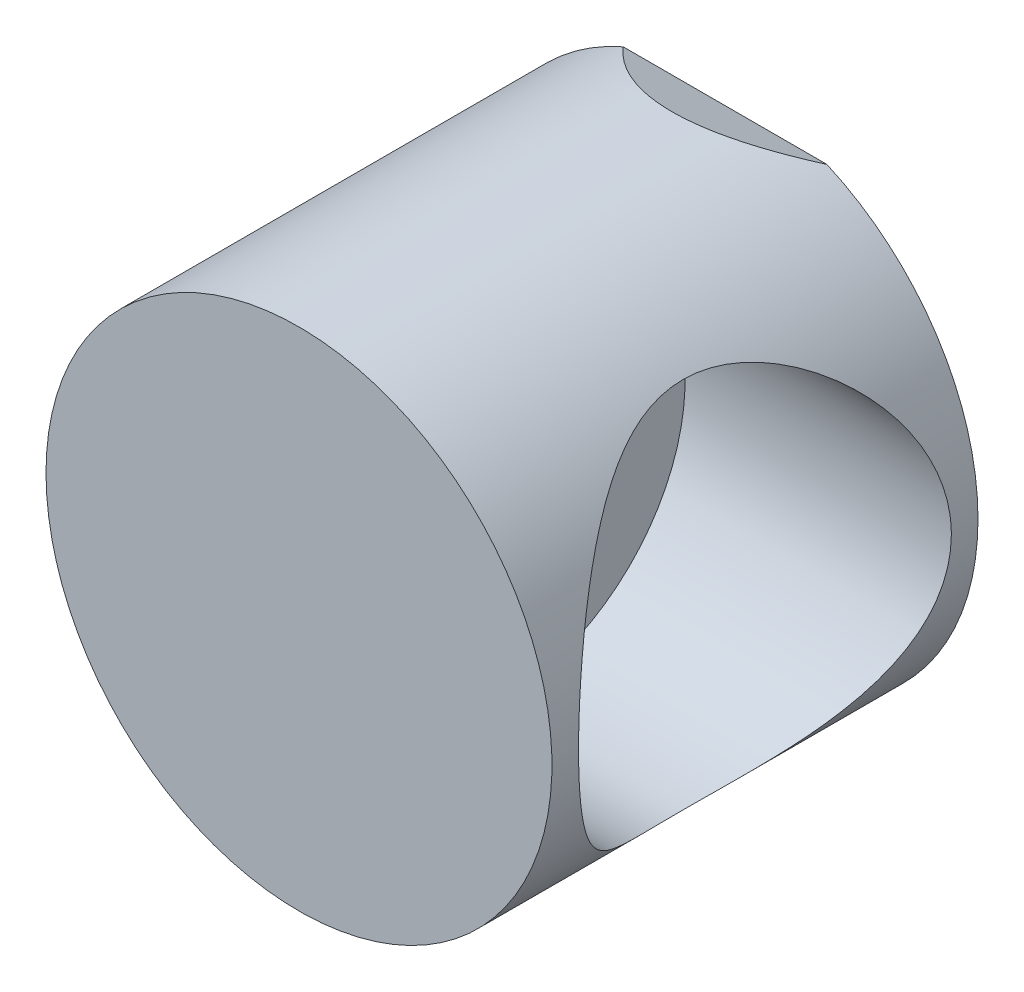
ISO-10303-21;
HEADER;
FILE_DESCRIPTION(('STEP AP214'),'2;1');
FILE_NAME('part.step','',(''),(''),'','','');
FILE_SCHEMA(('AUTOMOTIVE_DESIGN { 1 0 10303 214 1 1 1 1 }'));
ENDSEC;
DATA;
#1=APPLICATION_CONTEXT('core data for automotive mechanical design processes');
#2=APPLICATION_PROTOCOL_DEFINITION('international standard','automotive_design',2000,#1);
#3=PRODUCT_CONTEXT('',#1,'mechanical');
#4=PRODUCT('Part','Part','',(#3));
#5=PRODUCT_RELATED_PRODUCT_CATEGORY('part','',(#4));
#6=PRODUCT_DEFINITION_FORMATION('','',#4);
#7=PRODUCT_DEFINITION_CONTEXT('part definition',#1,'design');
#8=PRODUCT_DEFINITION('design','',#6,#7);
#9=PRODUCT_DEFINITION_SHAPE('','',#8);
#10=(LENGTH_UNIT() NAMED_UNIT(*) SI_UNIT(.MILLI.,.METRE.));
#11=(NAMED_UNIT(*) PLANE_ANGLE_UNIT() SI_UNIT($,.RADIAN.));
#12=(NAMED_UNIT(*) SI_UNIT($,.STERADIAN.) SOLID_ANGLE_UNIT());
#13=UNCERTAINTY_MEASURE_WITH_UNIT(LENGTH_MEASURE(1.E-05),#10,'distance_accuracy_value','');
#14=(GEOMETRIC_REPRESENTATION_CONTEXT(3) GLOBAL_UNCERTAINTY_ASSIGNED_CONTEXT((#13)) GLOBAL_UNIT_ASSIGNED_CONTEXT((#10,
#11,#12)) REPRESENTATION_CONTEXT('',''));
#15=CARTESIAN_POINT('',(0.,0.,0.));
#16=DIRECTION('',(0.,0.,1.));
#17=DIRECTION('',(1.,0.,0.));
#18=AXIS2_PLACEMENT_3D('',#15,#16,#17);
#19=CARTESIAN_POINT('',(0.,0.,0.));
#20=DIRECTION('',(0.,0.,1.));
#21=DIRECTION('',(1.,0.,0.));
#22=AXIS2_PLACEMENT_3D('',#19,#20,#21);
#23=PLANE('',#22);
#24=CARTESIAN_POINT('',(0.,0.,0.));
#25=DIRECTION('',(0.,0.,-1.));
#26=DIRECTION('',(-1.,0.,0.));
#27=AXIS2_PLACEMENT_3D('',#24,#25,#26);
#28=CIRCLE('',#27,9.5);
#29=CARTESIAN_POINT('',(-9.5,0.,0.));
#30=VERTEX_POINT('',#29);
#31=EDGE_CURVE('E79',#30,#30,#28,.T.);
#32=ORIENTED_EDGE('',*,*,#31,.F.);
#33=EDGE_LOOP('',(#32));
#34=FACE_BOUND('',#33,.T.);
#35=ADVANCED_FACE('F36',(#34),#23,.T.);
#36=CARTESIAN_POINT('',(-0.499999999999997,-7.,-8.));
#37=DIRECTION('',(1.,0.,0.));
#38=DIRECTION('',(0.,0.,-1.));
#39=AXIS2_PLACEMENT_3D('',#36,#37,#38);
#40=PLANE('',#39);
#41=CARTESIAN_POINT('',(-0.499999999999997,0.,-8.));
#42=DIRECTION('',(-1.,0.,0.));
#43=DIRECTION('',(0.,0.,1.));
#44=AXIS2_PLACEMENT_3D('',#41,#42,#43);
#45=CIRCLE('',#44,4.);
#46=CARTESIAN_POINT('',(-0.499999999999997,0.,-4.));
#47=VERTEX_POINT('',#46);
#48=EDGE_CURVE('E82',#47,#47,#45,.F.);
#49=ORIENTED_EDGE('',*,*,#48,.F.);
#50=EDGE_LOOP('',(#49));
#51=FACE_BOUND('',#50,.T.);
#52=CARTESIAN_POINT('',(-0.499999999999997,0.,-8.));
#53=DIRECTION('',(-1.,0.,0.));
#54=DIRECTION('',(0.,0.,1.));
#55=AXIS2_PLACEMENT_3D('',#52,#53,#54);
#56=CIRCLE('',#55,7.);
#57=CARTESIAN_POINT('',(-0.499999999999997,0.,-0.999999999999996));
#58=VERTEX_POINT('',#57);
#59=EDGE_CURVE('E40',#58,#58,#56,.T.);
#60=ORIENTED_EDGE('',*,*,#59,.F.);
#61=EDGE_LOOP('',(#60));
#62=FACE_BOUND('',#61,.T.);
#63=ADVANCED_FACE('F38',(#51,#62),#40,.T.);
#64=CARTESIAN_POINT('',(0.,-9.0983408237649,-15.));
#65=DIRECTION('',(0.,-0.92794483738581,-0.372717558975992));
#66=DIRECTION('',(0.,0.372717558975992,-0.92794483738581));
#67=AXIS2_PLACEMENT_3D('',#64,#65,#66);
#68=PLANE('',#67);
#69=CARTESIAN_POINT('',(0.,0.,-37.6518933515901));
#70=DIRECTION('',(0.,-0.92794483738581,-0.372717558975992));
#71=DIRECTION('',(0.,0.372717558975992,-0.92794483738581));
#72=AXIS2_PLACEMENT_3D('',#69,#70,#71);
#73=ELLIPSE('',#72,25.4884691402798,9.5);
#74=CARTESIAN_POINT('',(-3.82331378800098,-8.6966816475298,-16.));
#75=VERTEX_POINT('',#74);
#76=CARTESIAN_POINT('',(3.82331378800098,-8.6966816475298,-16.));
#77=VERTEX_POINT('',#76);
#78=EDGE_CURVE('E62',#75,#77,#73,.F.);
#79=ORIENTED_EDGE('',*,*,#78,.F.);
#80=DIRECTION('',(-1.,0.,0.));
#81=VECTOR('',#80,1.);
#82=CARTESIAN_POINT('',(9.50000000000001,-8.6966816475298,-16.));
#83=LINE('',#82,#81);
#84=EDGE_CURVE('E64',#77,#75,#83,.T.);
#85=ORIENTED_EDGE('',*,*,#84,.F.);
#86=EDGE_LOOP('',(#79,#85));
#87=FACE_BOUND('',#86,.T.);
#88=ADVANCED_FACE('F66',(#87),#68,.T.);
#89=CARTESIAN_POINT('',(-0.108255951926131,7.61675230686671,-18.6886709044859));
#90=DIRECTION('',(0.,0.92794483738581,-0.372717558975992));
#91=DIRECTION('',(0.,0.372717558975992,0.92794483738581));
#92=AXIS2_PLACEMENT_3D('',#89,#90,#91);
#93=PLANE('',#92);
#94=CARTESIAN_POINT('',(0.,0.,-37.6518933515902));
#95=DIRECTION('',(0.,0.92794483738581,-0.372717558975992));
#96=DIRECTION('',(0.,-0.372717558975992,-0.92794483738581));
#97=AXIS2_PLACEMENT_3D('',#94,#95,#96);
#98=ELLIPSE('',#97,25.4884691402798,9.5);
#99=CARTESIAN_POINT('',(3.82331378800099,8.6966816475298,-16.));
#100=VERTEX_POINT('',#99);
#101=CARTESIAN_POINT('',(-3.82331378800098,8.6966816475298,-16.));
#102=VERTEX_POINT('',#101);
#103=EDGE_CURVE('E75',#100,#102,#98,.F.);
#104=ORIENTED_EDGE('',*,*,#103,.F.);
#105=DIRECTION('',(-1.,0.,0.));
#106=VECTOR('',#105,1.);
#107=CARTESIAN_POINT('',(9.50000000000001,8.6966816475298,-16.));
#108=LINE('',#107,#106);
#109=EDGE_CURVE('E54',#102,#100,#108,.F.);
#110=ORIENTED_EDGE('',*,*,#109,.F.);
#111=EDGE_LOOP('',(#104,#110));
#112=FACE_BOUND('',#111,.T.);
#113=ADVANCED_FACE('F123',(#112),#93,.T.);
#114=CARTESIAN_POINT('',(9.50000000000001,0.,-16.));
#115=DIRECTION('',(0.,0.,-1.));
#116=DIRECTION('',(-1.,0.,0.));
#117=AXIS2_PLACEMENT_3D('',#114,#115,#116);
#118=PLANE('',#117);
#119=ORIENTED_EDGE('',*,*,#109,.T.);
#120=CARTESIAN_POINT('',(0.,0.,-16.));
#121=DIRECTION('',(0.,0.,-1.));
#122=DIRECTION('',(-1.,0.,0.));
#123=AXIS2_PLACEMENT_3D('',#120,#121,#122);
#124=CIRCLE('',#123,9.5);
#125=EDGE_CURVE('E71',#77,#100,#124,.F.);
#126=ORIENTED_EDGE('',*,*,#125,.F.);
#127=ORIENTED_EDGE('',*,*,#84,.T.);
#128=CARTESIAN_POINT('',(0.,0.,-16.));
#129=DIRECTION('',(0.,0.,-1.));
#130=DIRECTION('',(-1.,0.,0.));
#131=AXIS2_PLACEMENT_3D('',#128,#129,#130);
#132=CIRCLE('',#131,9.5);
#133=EDGE_CURVE('E78',#102,#75,#132,.F.);
#134=ORIENTED_EDGE('',*,*,#133,.F.);
#135=EDGE_LOOP('',(#119,#126,#127,#134));
#136=FACE_BOUND('',#135,.T.);
#137=ADVANCED_FACE('F72',(#136),#118,.T.);
#138=CARTESIAN_POINT('',(9.50000000000001,0.,-8.));
#139=DIRECTION('',(-1.,0.,0.));
#140=DIRECTION('',(0.,0.,1.));
#141=AXIS2_PLACEMENT_3D('',#138,#139,#140);
#142=CYLINDRICAL_SURFACE('',#141,7.);
#143=ORIENTED_EDGE('',*,*,#59,.T.);
#144=EDGE_LOOP('',(#143));
#145=FACE_BOUND('',#144,.T.);
#146=CARTESIAN_POINT('',(9.5,0.,-15.));
#147=CARTESIAN_POINT('',(9.49999955541205,-0.171776685952553,-14.9999995379097));
#148=CARTESIAN_POINT('',(9.49533098908795,-0.343560225193648,-14.9936674467285));
#149=CARTESIAN_POINT('',(9.47676656087095,-0.685767013978319,-14.9684414714967));
#150=CARTESIAN_POINT('',(9.46286666358579,-0.856189635622143,-14.9495420937666));
#151=CARTESIAN_POINT('',(9.42614477075101,-1.19448027730661,-14.8994561720474));
#152=CARTESIAN_POINT('',(9.40331045412692,-1.36234443550678,-14.8682526594889));
#153=CARTESIAN_POINT('',(9.34923642147448,-1.69412177418581,-14.7940317146752));
#154=CARTESIAN_POINT('',(9.31799303174897,-1.85803319363687,-14.7510091188109));
#155=CARTESIAN_POINT('',(9.24799919952023,-2.17977978031129,-14.6540670672471));
#156=CARTESIAN_POINT('',(9.20929698937563,-2.33764656863681,-14.6002175319022));
#157=CARTESIAN_POINT('',(9.12502997386116,-2.64757708116554,-14.4821196135556));
#158=CARTESIAN_POINT('',(9.07946246255211,-2.79963848744044,-14.4178671295121));
#159=CARTESIAN_POINT('',(8.93375835423318,-3.24586369811695,-14.2106167564135));
#160=CARTESIAN_POINT('',(8.82453680001396,-3.53043821689032,-14.0530124893339));
#161=CARTESIAN_POINT('',(8.57825760516843,-4.09475115131068,-13.6882565565468));
#162=CARTESIAN_POINT('',(8.43956658164152,-4.37165864095569,-13.4778886648323));
#163=CARTESIAN_POINT('',(8.15091482841139,-4.88879093732242,-13.0218291370732));
#164=CARTESIAN_POINT('',(8.00093707508744,-5.12895860571657,-12.7760836103484));
#165=CARTESIAN_POINT('',(7.76049967158025,-5.48181424616637,-12.3579415308006));
#166=CARTESIAN_POINT('',(7.67032010942563,-5.60696990323276,-12.1957098019707));
#167=CARTESIAN_POINT('',(7.49198173465386,-5.84312192087893,-11.8600581456795));
#168=CARTESIAN_POINT('',(7.40382351786428,-5.95411414945518,-11.6866349753719));
#169=CARTESIAN_POINT('',(7.23242362575897,-6.16117658422522,-11.3290425066135));
#170=CARTESIAN_POINT('',(7.14917671636972,-6.25726286073934,-11.1448850798921));
#171=CARTESIAN_POINT('',(6.99079488630454,-6.43372619017791,-10.7660198309281));
#172=CARTESIAN_POINT('',(6.91565541664659,-6.51411207312527,-10.5713180180921));
#173=CARTESIAN_POINT('',(6.75445495057007,-6.68168937246028,-10.1058150140408));
#174=CARTESIAN_POINT('',(6.67288937491812,-6.7624720984525,-9.83099179050707));
#175=CARTESIAN_POINT('',(6.57371545179302,-6.85845271679183,-9.40803028557168));
#176=CARTESIAN_POINT('',(6.54452964476944,-6.88623891682234,-9.26533732895986));
#177=CARTESIAN_POINT('',(6.49495803127038,-6.93301436118631,-8.97703616186756));
#178=CARTESIAN_POINT('',(6.47456778607314,-6.95200804306041,-8.83142946073562));
#179=CARTESIAN_POINT('',(6.44335448167087,-6.98094872877254,-8.53704310231851));
#180=CARTESIAN_POINT('',(6.43261322697401,-6.99081839898816,-8.38824706610708));
#181=CARTESIAN_POINT('',(6.42151697724789,-7.00101267212038,-8.08994042638532));
#182=CARTESIAN_POINT('',(6.42116154926355,-7.00133767292664,-7.94042985292186));
#183=CARTESIAN_POINT('',(6.43085789106656,-6.99243223741762,-7.64195345069195));
#184=CARTESIAN_POINT('',(6.4409155034946,-6.98319643664374,-7.49298797486146));
#185=CARTESIAN_POINT('',(6.47094998819331,-6.95537341601778,-7.19694696395328));
#186=CARTESIAN_POINT('',(6.49092795496829,-6.9367851643147,-7.04987163925158));
#187=CARTESIAN_POINT('',(6.54244989420852,-6.8882310628938,-6.74351062107689));
#188=CARTESIAN_POINT('',(6.57498150538566,-6.85728212605807,-6.58454794134433));
#189=CARTESIAN_POINT('',(6.64948330997911,-6.78506116073618,-6.27117635874643));
#190=CARTESIAN_POINT('',(6.69145981128797,-6.74378223115349,-6.11677057758291));
#191=CARTESIAN_POINT('',(6.78322056918064,-6.65147770047985,-5.81297003630694));
#192=CARTESIAN_POINT('',(6.83301948543713,-6.60043375922959,-5.66358533732154));
#193=CARTESIAN_POINT('',(6.93868686353358,-6.48926082247947,-5.37054155145404));
#194=CARTESIAN_POINT('',(6.9945537026046,-6.42913425431028,-5.22688094773313));
#195=CARTESIAN_POINT('',(7.13163878833073,-6.27722782732685,-4.8950727394109));
#196=CARTESIAN_POINT('',(7.21478130229932,-6.18181548157259,-4.70937668568039));
#197=CARTESIAN_POINT('',(7.38614645460775,-5.97601774061044,-4.34893105987983));
#198=CARTESIAN_POINT('',(7.47437077848852,-5.86562736082084,-4.17418516036361));
#199=CARTESIAN_POINT('',(7.65314642626286,-5.63038165286863,-3.83570991029862));
#200=CARTESIAN_POINT('',(7.74369983406161,-5.50551299348858,-3.67199093583184));
#201=CARTESIAN_POINT('',(7.92457711931574,-5.24181678255556,-3.35611390836703));
#202=CARTESIAN_POINT('',(8.0149010226231,-5.10299088178997,-3.20395449189532));
#203=CARTESIAN_POINT('',(8.19443723561548,-4.80949416448075,-2.9095572750946));
#204=CARTESIAN_POINT('',(8.28361271965059,-4.6546174339426,-2.76750188573861));
#205=CARTESIAN_POINT('',(8.45726031506847,-4.33110290650534,-2.49672473915292));
#206=CARTESIAN_POINT('',(8.54173188426548,-4.16246352878738,-2.36800451750505));
#207=CARTESIAN_POINT('',(8.70369281598265,-3.81220430302919,-2.12527253028348));
#208=CARTESIAN_POINT('',(8.7811932512488,-3.63060589217282,-2.01123731048931));
#209=CARTESIAN_POINT('',(8.92724463591068,-3.25497524730534,-1.7990632508854));
#210=CARTESIAN_POINT('',(8.99579918023937,-3.06094805485953,-1.7009180217954));
#211=CARTESIAN_POINT('',(9.10583426828904,-2.71258675994345,-1.54489046885185));
#212=CARTESIAN_POINT('',(9.14976026757035,-2.56075245849196,-1.48312381115819));
#213=CARTESIAN_POINT('',(9.23072281936376,-2.25150704185519,-1.36993135333547));
#214=CARTESIAN_POINT('',(9.26776091235204,-2.09409718303787,-1.31850324078802));
#215=CARTESIAN_POINT('',(9.33415539124307,-1.77484452477982,-1.22670987236036));
#216=CARTESIAN_POINT('',(9.36352686759235,-1.61301113703341,-1.18632287635896));
#217=CARTESIAN_POINT('',(9.41405304054827,-1.28569422979342,-1.11705318904569));
#218=CARTESIAN_POINT('',(9.43521098910392,-1.12021218237982,-1.08816594456784));
#219=CARTESIAN_POINT('',(9.46790733508565,-0.796087809469865,-1.04360117423619));
#220=CARTESIAN_POINT('',(9.4799187532499,-0.637582505338162,-1.02727356284332));
#221=CARTESIAN_POINT('',(9.49596619231267,-0.319386948066158,-1.00547153625326));
#222=CARTESIAN_POINT('',(9.50000041332216,-0.15969643566463,-0.999999570406321));
#223=CARTESIAN_POINT('',(9.49999955541205,0.171776685952554,-1.00000046209032));
#224=CARTESIAN_POINT('',(9.49533098908795,0.343560225193649,-1.00633255327146));
#225=CARTESIAN_POINT('',(9.47676656087095,0.685767013978319,-1.03155852850331));
#226=CARTESIAN_POINT('',(9.46286666358579,0.856189635622142,-1.05045790623339));
#227=CARTESIAN_POINT('',(9.42614477075101,1.19448027730661,-1.10054382795259));
#228=CARTESIAN_POINT('',(9.40331045412692,1.36234443550678,-1.13174734051107));
#229=CARTESIAN_POINT('',(9.34923642147448,1.69412177418581,-1.20596828532482));
#230=CARTESIAN_POINT('',(9.31799303174897,1.85803319363687,-1.24899088118914));
#231=CARTESIAN_POINT('',(9.24799919952023,2.17977978031129,-1.34593293275293));
#232=CARTESIAN_POINT('',(9.20929698937563,2.33764656863681,-1.39978246809779));
#233=CARTESIAN_POINT('',(9.12502997386116,2.64757708116554,-1.51788038644444));
#234=CARTESIAN_POINT('',(9.07946246255211,2.79963848744045,-1.58213287048791));
#235=CARTESIAN_POINT('',(8.93375835423318,3.24586369811696,-1.78938324358651));
#236=CARTESIAN_POINT('',(8.82453680001396,3.53043821689032,-1.94698751066605));
#237=CARTESIAN_POINT('',(8.57825760516843,4.09475115131068,-2.31174344345321));
#238=CARTESIAN_POINT('',(8.43956658164152,4.37165864095569,-2.52211133516767));
#239=CARTESIAN_POINT('',(8.15091482841139,4.88879093732242,-2.97817086292678));
#240=CARTESIAN_POINT('',(8.00093707508744,5.12895860571657,-3.22391638965163));
#241=CARTESIAN_POINT('',(7.76049967158025,5.48181424616637,-3.64205846919939));
#242=CARTESIAN_POINT('',(7.67032010942563,5.60696990323276,-3.80429019802929));
#243=CARTESIAN_POINT('',(7.49198173465386,5.84312192087893,-4.13994185432051));
#244=CARTESIAN_POINT('',(7.40382351786428,5.95411414945518,-4.31336502462811));
#245=CARTESIAN_POINT('',(7.23242362575897,6.16117658422522,-4.6709574933865));
#246=CARTESIAN_POINT('',(7.14917671636972,6.25726286073933,-4.85511492010789));
#247=CARTESIAN_POINT('',(6.99079488630454,6.43372619017791,-5.23398016907187));
#248=CARTESIAN_POINT('',(6.91565541664659,6.51411207312527,-5.42868198190792));
#249=CARTESIAN_POINT('',(6.75445495057007,6.68168937246028,-5.89418498595919));
#250=CARTESIAN_POINT('',(6.67288937491812,6.7624720984525,-6.16900820949293));
#251=CARTESIAN_POINT('',(6.57371545179302,6.85845271679183,-6.59196971442833));
#252=CARTESIAN_POINT('',(6.54452964476944,6.88623891682234,-6.73466267104014));
#253=CARTESIAN_POINT('',(6.49495803127038,6.93301436118631,-7.02296383813244));
#254=CARTESIAN_POINT('',(6.47456778607314,6.95200804306041,-7.16857053926438));
#255=CARTESIAN_POINT('',(6.44335448167088,6.98094872877254,-7.46295689768149));
#256=CARTESIAN_POINT('',(6.43261322697401,6.99081839898816,-7.61175293389292));
#257=CARTESIAN_POINT('',(6.42151697724789,7.00101267212038,-7.91005957361468));
#258=CARTESIAN_POINT('',(6.42116154926355,7.00133767292664,-8.05957014707814));
#259=CARTESIAN_POINT('',(6.43085789106656,6.99243223741762,-8.35804654930805));
#260=CARTESIAN_POINT('',(6.4409155034946,6.98319643664374,-8.50701202513853));
#261=CARTESIAN_POINT('',(6.47094998819332,6.95537341601778,-8.80305303604672));
#262=CARTESIAN_POINT('',(6.49092795496829,6.9367851643147,-8.95012836074842));
#263=CARTESIAN_POINT('',(6.54244989420852,6.8882310628938,-9.25648937892311));
#264=CARTESIAN_POINT('',(6.57498150538566,6.85728212605807,-9.41545205865567));
#265=CARTESIAN_POINT('',(6.64948330997911,6.78506116073618,-9.72882364125357));
#266=CARTESIAN_POINT('',(6.69145981128797,6.74378223115349,-9.8832294224171));
#267=CARTESIAN_POINT('',(6.78322056918064,6.65147770047984,-10.1870299636931));
#268=CARTESIAN_POINT('',(6.83301948543713,6.60043375922959,-10.3364146626785));
#269=CARTESIAN_POINT('',(6.93868686353358,6.48926082247947,-10.629458448546));
#270=CARTESIAN_POINT('',(6.9945537026046,6.42913425431028,-10.7731190522669));
#271=CARTESIAN_POINT('',(7.13163878833073,6.27722782732685,-11.1049272605891));
#272=CARTESIAN_POINT('',(7.21478130229932,6.18181548157258,-11.2906233143196));
#273=CARTESIAN_POINT('',(7.38614645460775,5.97601774061043,-11.6510689401202));
#274=CARTESIAN_POINT('',(7.47437077848852,5.86562736082084,-11.8258148396364));
#275=CARTESIAN_POINT('',(7.65314642626286,5.63038165286862,-12.1642900897014));
#276=CARTESIAN_POINT('',(7.74369983406161,5.50551299348857,-12.3280090641682));
#277=CARTESIAN_POINT('',(7.92457711931575,5.24181678255555,-12.643886091633));
#278=CARTESIAN_POINT('',(8.01490102262311,5.10299088178996,-12.7960455081047));
#279=CARTESIAN_POINT('',(8.19443723561549,4.80949416448074,-13.0904427249054));
#280=CARTESIAN_POINT('',(8.2836127196506,4.65461743394259,-13.2324981142614));
#281=CARTESIAN_POINT('',(8.45726031506847,4.33110290650532,-13.5032752608471));
#282=CARTESIAN_POINT('',(8.54173188426548,4.16246352878737,-13.631995482495));
#283=CARTESIAN_POINT('',(8.70369281598266,3.81220430302918,-13.8747274697165));
#284=CARTESIAN_POINT('',(8.78119325124881,3.6306058921728,-13.9887626895107));
#285=CARTESIAN_POINT('',(8.92724463591069,3.25497524730533,-14.2009367491146));
#286=CARTESIAN_POINT('',(8.99579918023937,3.06094805485951,-14.2990819782046));
#287=CARTESIAN_POINT('',(9.10583426828904,2.71258675994344,-14.4551095311482));
#288=CARTESIAN_POINT('',(9.14976026757035,2.56075245849195,-14.5168761888418));
#289=CARTESIAN_POINT('',(9.23072281936377,2.25150704185518,-14.6300686466645));
#290=CARTESIAN_POINT('',(9.26776091235204,2.09409718303786,-14.681496759212));
#291=CARTESIAN_POINT('',(9.33415539124308,1.7748445247798,-14.7732901276396));
#292=CARTESIAN_POINT('',(9.36352686759235,1.6130111370334,-14.813677123641));
#293=CARTESIAN_POINT('',(9.41405304054827,1.2856942297934,-14.8829468109543));
#294=CARTESIAN_POINT('',(9.43521098910392,1.12021218237981,-14.9118340554322));
#295=CARTESIAN_POINT('',(9.46790733508566,0.796087809469852,-14.9563988257638));
#296=CARTESIAN_POINT('',(9.47991875324991,0.637582505338151,-14.9727264371567));
#297=CARTESIAN_POINT('',(9.49596619231267,0.319386948066152,-14.9945284637467));
#298=CARTESIAN_POINT('',(9.50000041332216,0.159696435664627,-15.0000004295937));
#299=CARTESIAN_POINT('',(9.5,0.,-15.));
#300=B_SPLINE_CURVE_WITH_KNOTS('',3,(#146,#147,#148,#149,#150,#151,#152,#153,#154,#155,#156,
#157,#158,#159,#160,#161,#162,#163,#164,#165,#166,#167,#168,#169,#170,#171,#172,#173,#174,#175,
#176,#177,#178,#179,#180,#181,#182,#183,#184,#185,#186,#187,#188,#189,#190,#191,#192,#193,#194,
#195,#196,#197,#198,#199,#200,#201,#202,#203,#204,#205,#206,#207,#208,#209,#210,#211,#212,#213,
#214,#215,#216,#217,#218,#219,#220,#221,#222,#223,#224,#225,#226,#227,#228,#229,#230,#231,#232,
#233,#234,#235,#236,#237,#238,#239,#240,#241,#242,#243,#244,#245,#246,#247,#248,#249,#250,#251,
#252,#253,#254,#255,#256,#257,#258,#259,#260,#261,#262,#263,#264,#265,#266,#267,#268,#269,#270,
#271,#272,#273,#274,#275,#276,#277,#278,#279,#280,#281,#282,#283,#284,#285,#286,#287,#288,#289,
#290,#291,#292,#293,#294,#295,#296,#297,#298,#299),.UNSPECIFIED.,.T.,.F.,(4,2,2,2,2,2,2,2,2,2,2,
2,2,2,2,2,2,2,2,2,2,2,2,2,2,2,2,2,2,2,2,2,2,2,2,2,2,2,2,2,2,2,2,2,2,2,2,2,2,2,2,2,2,2,2,2,2,2,2,
2,2,2,2,2,2,2,2,2,2,2,2,2,2,2,2,2,4),(0.,0.515163605013197,1.03055255746482,1.54665478009514,
2.06298284087337,2.57607778227243,3.08937549024409,4.11479706697071,5.23415084878313,
6.35522814561899,7.02619557357636,7.69735830255475,8.36779233588973,9.0378482192703,
9.92757547003859,10.3719471634058,10.816094339396,11.2639724148655,11.7118318195669,
12.1599426494335,12.6081029299775,13.1029236514249,13.598075831437,14.0941672774528,
14.5901263768995,15.2633476684878,15.9367935553124,16.6108645327088,17.2848558782,
17.9689268779854,18.6530765631033,19.3361196330275,20.0188873691962,20.527492653794,
21.0359840519631,21.5434668912918,22.0507485995579,22.5295751346067,23.0085096946056,
23.5236732996188,24.0390622520704,24.5551644747007,25.071492535479,25.584587476878,
26.0978851848497,27.1233067615763,28.2426605433887,29.3637378402246,30.034705268182,
30.7058679971604,31.3763020304953,32.0463579138759,32.9360851646442,33.3804568580114,
33.8246040340016,34.2724821094711,34.7203415141725,35.1684523440391,35.6166126245831,
36.1114333460305,36.6065855260426,37.1026769720584,37.5986360715051,38.2718573630933,
38.945303249918,39.6193742273144,40.2933655728056,40.977436572591,41.6615862577089,
42.3446293276331,43.0273970638018,43.5360023483996,44.0444937465687,44.5519765858974,
45.0592582941634,45.5380848292123,46.0170193892112),.UNSPECIFIED.);
#301=CARTESIAN_POINT('',(9.5,0.,-15.));
#302=VERTEX_POINT('',#301);
#303=EDGE_CURVE('E46',#302,#302,#300,.T.);
#304=ORIENTED_EDGE('',*,*,#303,.F.);
#305=EDGE_LOOP('',(#304));
#306=FACE_BOUND('',#305,.T.);
#307=ADVANCED_FACE('F110',(#145,#306),#142,.F.);
#308=CARTESIAN_POINT('',(9.50000000000001,0.,-8.));
#309=DIRECTION('',(-1.,0.,0.));
#310=DIRECTION('',(0.,0.,1.));
#311=AXIS2_PLACEMENT_3D('',#308,#309,#310);
#312=CYLINDRICAL_SURFACE('',#311,4.);
#313=CARTESIAN_POINT('',(-8.61684396980705,4.,-8.));
#314=CARTESIAN_POINT('',(-8.61684479291634,3.99999920365226,-7.89339588951191));
#315=CARTESIAN_POINT('',(-8.61882923618132,3.9957319358542,-7.78675494811101));
#316=CARTESIAN_POINT('',(-8.62670095753731,3.97870775218113,-7.57425234767577));
#317=CARTESIAN_POINT('',(-8.63259074890548,3.96594536927521,-7.46839123488566));
#318=CARTESIAN_POINT('',(-8.64809004641728,3.93203356564338,-7.25805909420674));
#319=CARTESIAN_POINT('',(-8.65770736697029,3.91086652305503,-7.15359146674129));
#320=CARTESIAN_POINT('',(-8.6803354198555,3.860379986894,-6.94700660151014));
#321=CARTESIAN_POINT('',(-8.69334758173029,3.8310570585935,-6.84489037366222));
#322=CARTESIAN_POINT('',(-8.73674622007323,3.7315599849548,-6.54402847681404));
#323=CARTESIAN_POINT('',(-8.77158383752974,3.64967476491844,-6.34965608494503));
#324=CARTESIAN_POINT('',(-8.8491231047003,3.45741232788934,-5.97756390364931));
#325=CARTESIAN_POINT('',(-8.8918230094151,3.34704143098506,-5.7998404322496));
#326=CARTESIAN_POINT('',(-8.98331887532201,3.09340545265793,-5.45455275976188));
#327=CARTESIAN_POINT('',(-9.0323243701199,2.94861066888091,-5.28816517116338));
#328=CARTESIAN_POINT('',(-9.12918799654512,2.63345602204265,-4.98116894420088));
#329=CARTESIAN_POINT('',(-9.17704567399664,2.46308622671577,-4.84057036855449));
#330=CARTESIAN_POINT('',(-9.26877681609602,2.09231676497945,-4.58307831936011));
#331=CARTESIAN_POINT('',(-9.31237856691952,1.89091878265369,-4.46751658857194));
#332=CARTESIAN_POINT('',(-9.38811444393872,1.4693730575349,-4.27242564263145));
#333=CARTESIAN_POINT('',(-9.42025376150082,1.24923385879032,-4.19288011123606));
#334=CARTESIAN_POINT('',(-9.46795722737466,0.808831057041757,-4.07636813025215));
#335=CARTESIAN_POINT('',(-9.48430966668667,0.589192572355979,-4.0373682087497));
#336=CARTESIAN_POINT('',(-9.50146415645256,0.145921296137905,-3.99647791119913));
#337=CARTESIAN_POINT('',(-9.50227265579288,-0.0777098003891295,-3.99457214548393));
#338=CARTESIAN_POINT('',(-9.48870803605992,-0.507809014322279,-4.02687201870989));
#339=CARTESIAN_POINT('',(-9.47527492001272,-0.714480298467526,-4.05884167427961));
#340=CARTESIAN_POINT('',(-9.43603370637273,-1.11920616443698,-4.15414388128753));
#341=CARTESIAN_POINT('',(-9.41022469558179,-1.31726010922456,-4.21747874712743));
#342=CARTESIAN_POINT('',(-9.34822412974687,-1.70277425779943,-4.37445787547147));
#343=CARTESIAN_POINT('',(-9.31187993215786,-1.89002630779711,-4.46855054659769));
#344=CARTESIAN_POINT('',(-9.23235185267789,-2.24657465770714,-4.68392928340789));
#345=CARTESIAN_POINT('',(-9.18916553920334,-2.4158645382903,-4.80522502303991));
#346=CARTESIAN_POINT('',(-9.09661565977341,-2.74459541942161,-5.08168462483474));
#347=CARTESIAN_POINT('',(-9.04703120212881,-2.90245769431404,-5.23865435362879));
#348=CARTESIAN_POINT('',(-8.94958496430327,-3.19030905144212,-5.57692731834381));
#349=CARTESIAN_POINT('',(-8.90172388368923,-3.32028691843321,-5.7582402977487));
#350=CARTESIAN_POINT('',(-8.81154640450858,-3.55285473738947,-6.14786429218683));
#351=CARTESIAN_POINT('',(-8.76947528387452,-3.65435735480679,-6.35688602183361));
#352=CARTESIAN_POINT('',(-8.69857730626177,-3.82007496880753,-6.79129673851623));
#353=CARTESIAN_POINT('',(-8.66974074928303,-3.88431728369774,-7.01667359763221));
#354=CARTESIAN_POINT('',(-8.63099704573982,-3.9696294380598,-7.46156479271675));
#355=CARTESIAN_POINT('',(-8.61996848160524,-3.993263518851,-7.68048795833547));
#356=CARTESIAN_POINT('',(-8.61488120321362,-4.0042333597211,-8.11940280460085));
#357=CARTESIAN_POINT('',(-8.62081640806785,-3.99158212674786,-8.33939407414844));
#358=CARTESIAN_POINT('',(-8.6478273255981,-3.93268182382048,-8.75889632288022));
#359=CARTESIAN_POINT('',(-8.66787813142854,-3.88870483169292,-8.9588008376862));
#360=CARTESIAN_POINT('',(-8.71954105498789,-3.77142924464059,-9.34822017288409));
#361=CARTESIAN_POINT('',(-8.75115591317121,-3.69812369903528,-9.53773251828346));
#362=CARTESIAN_POINT('',(-8.82403036683286,-3.52079864778837,-9.91005459670814));
#363=CARTESIAN_POINT('',(-8.86564471807188,-3.41559931118618,-10.0922307166274));
#364=CARTESIAN_POINT('',(-8.95333477001598,-3.17863832384833,-10.4372317288205));
#365=CARTESIAN_POINT('',(-8.99941242567044,-3.04686500598842,-10.6000480712313));
#366=CARTESIAN_POINT('',(-9.09547779348834,-2.74753739971471,-10.9158563249657));
#367=CARTESIAN_POINT('',(-9.14547084697947,-2.57791458120941,-11.0668938400701));
#368=CARTESIAN_POINT('',(-9.24017447014067,-2.21458437739197,-11.3387250785678));
#369=CARTESIAN_POINT('',(-9.28488460226699,-2.02087499989838,-11.4595162978189));
#370=CARTESIAN_POINT('',(-9.36431835055757,-1.61330019295804,-11.6673884327267));
#371=CARTESIAN_POINT('',(-9.39900758645444,-1.39936863834623,-11.7543536414871));
#372=CARTESIAN_POINT('',(-9.45417439015116,-0.958072669830156,-11.8904138875023));
#373=CARTESIAN_POINT('',(-9.47466061430599,-0.730716529714421,-11.9395319935891));
#374=CARTESIAN_POINT('',(-9.49809838044287,-0.286474708646805,-11.9955540562212));
#375=CARTESIAN_POINT('',(-9.50219336575512,-0.0699943441316092,-12.0052118342112));
#376=CARTESIAN_POINT('',(-9.49557132455836,0.361433502234719,-11.9894778549098));
#377=CARTESIAN_POINT('',(-9.48485699289538,0.576381255820816,-11.9640924744103));
#378=CARTESIAN_POINT('',(-9.45042765512476,0.990478887183232,-11.8809702440041));
#379=CARTESIAN_POINT('',(-9.42720553396715,1.18991903602096,-11.8244581828662));
#380=CARTESIAN_POINT('',(-9.37033345964986,1.57640122736063,-11.6820371517927));
#381=CARTESIAN_POINT('',(-9.33668154771202,1.76344093296737,-11.5961226595855));
#382=CARTESIAN_POINT('',(-9.26029827486539,2.12916899229196,-11.39298853587));
#383=CARTESIAN_POINT('',(-9.21722419643882,2.30709321191543,-11.2745252319797));
#384=CARTESIAN_POINT('',(-9.12707637364082,2.64130416869979,-11.0114403567207));
#385=CARTESIAN_POINT('',(-9.08000111072523,2.79758263107986,-10.8668088301755));
#386=CARTESIAN_POINT('',(-8.98302613378497,3.09539281084939,-10.5436497962606));
#387=CARTESIAN_POINT('',(-8.93315836548485,3.23513635037117,-10.3634619530357));
#388=CARTESIAN_POINT('',(-8.8395833506371,3.4827243199905,-9.98053941778491));
#389=CARTESIAN_POINT('',(-8.79587960200701,3.59055067575902,-9.77779203962441));
#390=CARTESIAN_POINT('',(-8.73925649151902,3.72528384389563,-9.46130104392929));
#391=CARTESIAN_POINT('',(-8.72188950229769,3.76565500657312,-9.35390602657863));
#392=CARTESIAN_POINT('',(-8.69068132310427,3.8371324591037,-9.13559648905499));
#393=CARTESIAN_POINT('',(-8.67683839911789,3.86824330676976,-9.02468373011599));
#394=CARTESIAN_POINT('',(-8.65322907030115,3.92077213220802,-8.80048435539644));
#395=CARTESIAN_POINT('',(-8.64345191765459,3.94221567817545,-8.6872048404949));
#396=CARTESIAN_POINT('',(-8.6283096637991,3.97524931223112,-8.45898369117751));
#397=CARTESIAN_POINT('',(-8.6229411498672,3.98684702220686,-8.34404341263164));
#398=CARTESIAN_POINT('',(-8.61886983716841,3.9956332562663,-8.19071734970768));
#399=CARTESIAN_POINT('',(-8.61811067228956,3.99727028618603,-8.15259801895599));
#400=CARTESIAN_POINT('',(-8.61709758836867,3.99945380687364,-8.07632069909991));
#401=CARTESIAN_POINT('',(-8.61684367514598,4.00000028508082,-8.03816270955532));
#402=CARTESIAN_POINT('',(-8.61684396980705,4.,-8.));
#403=B_SPLINE_CURVE_WITH_KNOTS('',3,(#313,#314,#315,#316,#317,#318,#319,#320,#321,#322,#323,
#324,#325,#326,#327,#328,#329,#330,#331,#332,#333,#334,#335,#336,#337,#338,#339,#340,#341,#342,
#343,#344,#345,#346,#347,#348,#349,#350,#351,#352,#353,#354,#355,#356,#357,#358,#359,#360,#361,
#362,#363,#364,#365,#366,#367,#368,#369,#370,#371,#372,#373,#374,#375,#376,#377,#378,#379,#380,
#381,#382,#383,#384,#385,#386,#387,#388,#389,#390,#391,#392,#393,#394,#395,#396,#397,#398,#399,
#400,#401,#402),.UNSPECIFIED.,.T.,.F.,(4,2,2,2,2,2,2,2,2,2,2,2,2,2,2,2,2,2,2,2,2,2,2,2,2,2,2,2,
2,2,2,2,2,2,2,2,2,2,2,2,2,2,2,2,4),(0.,0.319772366886332,0.639750722482064,0.960403542474575,
1.28119160554606,1.91941485949961,2.5574966330489,3.2323692873258,3.90750471525451,
4.61265468584009,5.31748488536106,5.98495446117313,6.65214711051577,7.27789194731658,
7.90368296396899,8.53903757514858,9.17461849025398,9.85581264141672,10.5372802606464,
11.2420285324283,11.9462594453847,12.6041187250203,13.2617422158223,13.875971659252,
14.4903467574614,15.1310059864599,15.771947107277,16.4663870686194,17.1608845048288,
17.857737108415,18.5541646247675,19.2010623509438,19.8478423768722,20.4708232264834,
21.0939211466585,21.7452945265382,22.3969162314221,23.0939758531618,23.7914294597657,
24.1391554393292,24.48670998837,24.8333398493605,25.1797011309017,25.2941736343778,
25.4086474563105),.UNSPECIFIED.);
#404=CARTESIAN_POINT('',(-8.61684396980705,4.,-8.));
#405=VERTEX_POINT('',#404);
#406=EDGE_CURVE('E11',#405,#405,#403,.T.);
#407=ORIENTED_EDGE('',*,*,#406,.F.);
#408=EDGE_LOOP('',(#407));
#409=FACE_BOUND('',#408,.T.);
#410=ORIENTED_EDGE('',*,*,#48,.T.);
#411=EDGE_LOOP('',(#410));
#412=FACE_BOUND('',#411,.T.);
#413=ADVANCED_FACE('F101',(#409,#412),#312,.F.);
#414=CARTESIAN_POINT('',(0.,0.,0.));
#415=DIRECTION('',(0.,0.,-1.));
#416=DIRECTION('',(-1.,0.,0.));
#417=AXIS2_PLACEMENT_3D('',#414,#415,#416);
#418=CYLINDRICAL_SURFACE('',#417,9.5);
#419=ORIENTED_EDGE('',*,*,#31,.T.);
#420=EDGE_LOOP('',(#419));
#421=FACE_BOUND('',#420,.T.);
#422=ORIENTED_EDGE('',*,*,#406,.T.);
#423=EDGE_LOOP('',(#422));
#424=FACE_BOUND('',#423,.T.);
#425=ORIENTED_EDGE('',*,*,#303,.T.);
#426=EDGE_LOOP('',(#425));
#427=FACE_BOUND('',#426,.T.);
#428=ORIENTED_EDGE('',*,*,#103,.T.);
#429=ORIENTED_EDGE('',*,*,#133,.T.);
#430=ORIENTED_EDGE('',*,*,#78,.T.);
#431=ORIENTED_EDGE('',*,*,#125,.T.);
#432=EDGE_LOOP('',(#428,#429,#430,#431));
#433=FACE_BOUND('',#432,.T.);
#434=ADVANCED_FACE('F77',(#421,#424,#427,#433),#418,.T.);
#435=CLOSED_SHELL('',(#35,#63,#88,#113,#137,#307,#413,#434));
#436=MANIFOLD_SOLID_BREP('B2',#435);
#437=ADVANCED_BREP_SHAPE_REPRESENTATION('',(#18,#436),#14);
#438=SHAPE_DEFINITION_REPRESENTATION(#9,#437);
ENDSEC;
END-ISO-10303-21;
